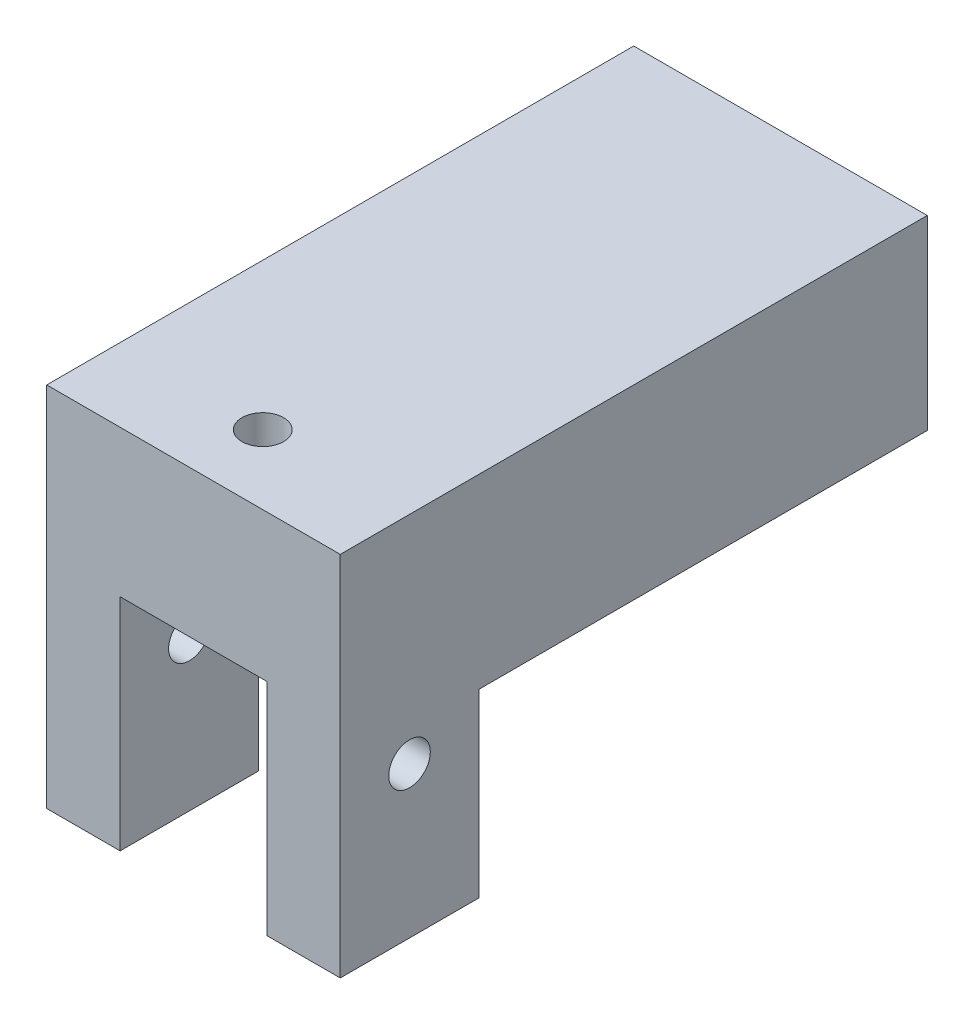
ISO-10303-21;
HEADER;
FILE_DESCRIPTION(('STEP AP214'),'2;1');
FILE_NAME('part.step','',(''),(''),'','','');
FILE_SCHEMA(('AUTOMOTIVE_DESIGN { 1 0 10303 214 1 1 1 1 }'));
ENDSEC;
DATA;
#1=APPLICATION_CONTEXT('core data for automotive mechanical design processes');
#2=APPLICATION_PROTOCOL_DEFINITION('international standard','automotive_design',2000,#1);
#3=PRODUCT_CONTEXT('',#1,'mechanical');
#4=PRODUCT('Part','Part','',(#3));
#5=PRODUCT_RELATED_PRODUCT_CATEGORY('part','',(#4));
#6=PRODUCT_DEFINITION_FORMATION('','',#4);
#7=PRODUCT_DEFINITION_CONTEXT('part definition',#1,'design');
#8=PRODUCT_DEFINITION('design','',#6,#7);
#9=PRODUCT_DEFINITION_SHAPE('','',#8);
#10=(LENGTH_UNIT() NAMED_UNIT(*) SI_UNIT(.MILLI.,.METRE.));
#11=(NAMED_UNIT(*) PLANE_ANGLE_UNIT() SI_UNIT($,.RADIAN.));
#12=(NAMED_UNIT(*) SI_UNIT($,.STERADIAN.) SOLID_ANGLE_UNIT());
#13=UNCERTAINTY_MEASURE_WITH_UNIT(LENGTH_MEASURE(1.E-05),#10,'distance_accuracy_value','');
#14=(GEOMETRIC_REPRESENTATION_CONTEXT(3) GLOBAL_UNCERTAINTY_ASSIGNED_CONTEXT((#13)) GLOBAL_UNIT_ASSIGNED_CONTEXT((#10,
#11,#12)) REPRESENTATION_CONTEXT('',''));
#15=CARTESIAN_POINT('',(0.,0.,0.));
#16=DIRECTION('',(0.,0.,1.));
#17=DIRECTION('',(1.,0.,0.));
#18=AXIS2_PLACEMENT_3D('',#15,#16,#17);
#19=CARTESIAN_POINT('',(25.4,0.,-11.9888));
#20=DIRECTION('',(0.,1.,0.));
#21=DIRECTION('',(0.,0.,1.));
#22=AXIS2_PLACEMENT_3D('',#19,#20,#21);
#23=PLANE('',#22);
#24=DIRECTION('',(-1.,0.,0.));
#25=VECTOR('',#24,1.);
#26=CARTESIAN_POINT('',(25.4,0.,0.));
#27=LINE('',#26,#25);
#28=CARTESIAN_POINT('',(25.4,0.,0.));
#29=VERTEX_POINT('',#28);
#30=CARTESIAN_POINT('',(19.05,0.,0.));
#31=VERTEX_POINT('',#30);
#32=EDGE_CURVE('E164',#29,#31,#27,.T.);
#33=ORIENTED_EDGE('',*,*,#32,.T.);
#34=DIRECTION('',(0.,0.,1.));
#35=VECTOR('',#34,1.);
#36=CARTESIAN_POINT('',(19.05,0.,-34.8840505991963));
#37=LINE('',#36,#35);
#38=CARTESIAN_POINT('',(19.05,0.,-11.9888));
#39=VERTEX_POINT('',#38);
#40=EDGE_CURVE('E225',#39,#31,#37,.T.);
#41=ORIENTED_EDGE('',*,*,#40,.F.);
#42=DIRECTION('',(-1.,0.,0.));
#43=VECTOR('',#42,1.);
#44=CARTESIAN_POINT('',(25.4,0.,-11.9888));
#45=LINE('',#44,#43);
#46=CARTESIAN_POINT('',(25.4,0.,-11.9888));
#47=VERTEX_POINT('',#46);
#48=EDGE_CURVE('E11',#47,#39,#45,.T.);
#49=ORIENTED_EDGE('',*,*,#48,.F.);
#50=DIRECTION('',(0.,0.,-1.));
#51=VECTOR('',#50,1.);
#52=CARTESIAN_POINT('',(25.4,0.,-11.9888));
#53=LINE('',#52,#51);
#54=EDGE_CURVE('E163',#29,#47,#53,.T.);
#55=ORIENTED_EDGE('',*,*,#54,.F.);
#56=EDGE_LOOP('',(#33,#41,#49,#55));
#57=FACE_BOUND('',#56,.T.);
#58=ADVANCED_FACE('F41',(#57),#23,.F.);
#59=CARTESIAN_POINT('',(25.4,15.6337,-11.9888));
#60=DIRECTION('',(0.,0.,1.));
#61=DIRECTION('',(0.,-1.,0.));
#62=AXIS2_PLACEMENT_3D('',#59,#60,#61);
#63=PLANE('',#62);
#64=ORIENTED_EDGE('',*,*,#48,.T.);
#65=DIRECTION('',(0.,-1.,0.));
#66=VECTOR('',#65,1.);
#67=CARTESIAN_POINT('',(19.05,19.05,-11.9888));
#68=LINE('',#67,#66);
#69=CARTESIAN_POINT('',(19.05,15.6337,-11.9888));
#70=VERTEX_POINT('',#69);
#71=EDGE_CURVE('E242',#70,#39,#68,.T.);
#72=ORIENTED_EDGE('',*,*,#71,.F.);
#73=DIRECTION('',(-1.,0.,0.));
#74=VECTOR('',#73,1.);
#75=CARTESIAN_POINT('',(25.4,15.6337,-11.9888));
#76=LINE('',#75,#74);
#77=CARTESIAN_POINT('',(25.4,15.6337,-11.9888));
#78=VERTEX_POINT('',#77);
#79=EDGE_CURVE('E173',#78,#70,#76,.T.);
#80=ORIENTED_EDGE('',*,*,#79,.F.);
#81=DIRECTION('',(0.,1.,0.));
#82=VECTOR('',#81,1.);
#83=CARTESIAN_POINT('',(25.4,15.6337,-11.9888));
#84=LINE('',#83,#82);
#85=EDGE_CURVE('E103',#47,#78,#84,.T.);
#86=ORIENTED_EDGE('',*,*,#85,.F.);
#87=EDGE_LOOP('',(#64,#72,#80,#86));
#88=FACE_BOUND('',#87,.T.);
#89=ADVANCED_FACE('F285',(#88),#63,.F.);
#90=CARTESIAN_POINT('',(6.35,0.,-11.9888));
#91=VERTEX_POINT('',#90);
#92=CARTESIAN_POINT('',(0.,0.,-11.9888));
#93=VERTEX_POINT('',#92);
#94=EDGE_CURVE('E51',#91,#93,#45,.T.);
#95=ORIENTED_EDGE('',*,*,#94,.F.);
#96=DIRECTION('',(0.,0.,1.));
#97=VECTOR('',#96,1.);
#98=CARTESIAN_POINT('',(6.35,0.,-34.8840505991963));
#99=LINE('',#98,#97);
#100=CARTESIAN_POINT('',(6.35,0.,0.));
#101=VERTEX_POINT('',#100);
#102=EDGE_CURVE('E222',#91,#101,#99,.T.);
#103=ORIENTED_EDGE('',*,*,#102,.T.);
#104=CARTESIAN_POINT('',(0.,0.,0.));
#105=VERTEX_POINT('',#104);
#106=EDGE_CURVE('E95',#101,#105,#27,.T.);
#107=ORIENTED_EDGE('',*,*,#106,.T.);
#108=DIRECTION('',(0.,0.,-1.));
#109=VECTOR('',#108,1.);
#110=CARTESIAN_POINT('',(0.,0.,-11.9888));
#111=LINE('',#110,#109);
#112=EDGE_CURVE('E144',#105,#93,#111,.T.);
#113=ORIENTED_EDGE('',*,*,#112,.T.);
#114=EDGE_LOOP('',(#95,#103,#107,#113));
#115=FACE_BOUND('',#114,.T.);
#116=ADVANCED_FACE('F43',(#115),#23,.F.);
#117=CARTESIAN_POINT('',(6.35,15.6337,-11.9888));
#118=VERTEX_POINT('',#117);
#119=CARTESIAN_POINT('',(0.,15.6337,-11.9888));
#120=VERTEX_POINT('',#119);
#121=EDGE_CURVE('E172',#118,#120,#76,.T.);
#122=ORIENTED_EDGE('',*,*,#121,.F.);
#123=DIRECTION('',(0.,1.,0.));
#124=VECTOR('',#123,1.);
#125=CARTESIAN_POINT('',(6.35,19.05,-11.9888));
#126=LINE('',#125,#124);
#127=EDGE_CURVE('E243',#91,#118,#126,.T.);
#128=ORIENTED_EDGE('',*,*,#127,.F.);
#129=ORIENTED_EDGE('',*,*,#94,.T.);
#130=DIRECTION('',(0.,1.,0.));
#131=VECTOR('',#130,1.);
#132=CARTESIAN_POINT('',(0.,15.6337,-11.9888));
#133=LINE('',#132,#131);
#134=EDGE_CURVE('E147',#93,#120,#133,.T.);
#135=ORIENTED_EDGE('',*,*,#134,.T.);
#136=EDGE_LOOP('',(#122,#128,#129,#135));
#137=FACE_BOUND('',#136,.T.);
#138=ADVANCED_FACE('F190',(#137),#63,.F.);
#139=CARTESIAN_POINT('',(25.4,15.6337,-11.9888));
#140=DIRECTION('',(0.,1.,0.));
#141=DIRECTION('',(0.,0.,1.));
#142=AXIS2_PLACEMENT_3D('',#139,#140,#141);
#143=PLANE('',#142);
#144=DIRECTION('',(0.,0.,-1.));
#145=VECTOR('',#144,1.);
#146=CARTESIAN_POINT('',(0.,15.6337,-11.9888));
#147=LINE('',#146,#145);
#148=CARTESIAN_POINT('',(0.,15.6337,-50.8));
#149=VERTEX_POINT('',#148);
#150=EDGE_CURVE('E152',#120,#149,#147,.T.);
#151=ORIENTED_EDGE('',*,*,#150,.T.);
#152=DIRECTION('',(-1.,0.,0.));
#153=VECTOR('',#152,1.);
#154=CARTESIAN_POINT('',(25.4,15.6337,-50.8));
#155=LINE('',#154,#153);
#156=CARTESIAN_POINT('',(25.4,15.6337,-50.8));
#157=VERTEX_POINT('',#156);
#158=EDGE_CURVE('E133',#157,#149,#155,.T.);
#159=ORIENTED_EDGE('',*,*,#158,.F.);
#160=DIRECTION('',(0.,0.,-1.));
#161=VECTOR('',#160,1.);
#162=CARTESIAN_POINT('',(25.4,15.6337,-11.9888));
#163=LINE('',#162,#161);
#164=EDGE_CURVE('E119',#78,#157,#163,.T.);
#165=ORIENTED_EDGE('',*,*,#164,.F.);
#166=ORIENTED_EDGE('',*,*,#79,.T.);
#167=EDGE_CURVE('E176',#70,#118,#76,.T.);
#168=ORIENTED_EDGE('',*,*,#167,.T.);
#169=ORIENTED_EDGE('',*,*,#121,.T.);
#170=EDGE_LOOP('',(#151,#159,#165,#166,#168,#169));
#171=FACE_BOUND('',#170,.T.);
#172=ADVANCED_FACE('F183',(#171),#143,.F.);
#173=CARTESIAN_POINT('',(25.4,31.75,-50.8));
#174=DIRECTION('',(0.,0.,1.));
#175=DIRECTION('',(1.,0.,0.));
#176=AXIS2_PLACEMENT_3D('',#173,#174,#175);
#177=PLANE('',#176);
#178=DIRECTION('',(0.,1.,0.));
#179=VECTOR('',#178,1.);
#180=CARTESIAN_POINT('',(0.,31.75,-50.8));
#181=LINE('',#180,#179);
#182=CARTESIAN_POINT('',(0.,31.75,-50.8));
#183=VERTEX_POINT('',#182);
#184=EDGE_CURVE('E129',#149,#183,#181,.T.);
#185=ORIENTED_EDGE('',*,*,#184,.T.);
#186=DIRECTION('',(-1.,0.,0.));
#187=VECTOR('',#186,1.);
#188=CARTESIAN_POINT('',(25.4,31.75,-50.8));
#189=LINE('',#188,#187);
#190=CARTESIAN_POINT('',(25.4,31.75,-50.8));
#191=VERTEX_POINT('',#190);
#192=EDGE_CURVE('E126',#191,#183,#189,.T.);
#193=ORIENTED_EDGE('',*,*,#192,.F.);
#194=DIRECTION('',(0.,1.,0.));
#195=VECTOR('',#194,1.);
#196=CARTESIAN_POINT('',(25.4,31.75,-50.8));
#197=LINE('',#196,#195);
#198=EDGE_CURVE('E112',#157,#191,#197,.T.);
#199=ORIENTED_EDGE('',*,*,#198,.F.);
#200=ORIENTED_EDGE('',*,*,#158,.T.);
#201=EDGE_LOOP('',(#185,#193,#199,#200));
#202=FACE_BOUND('',#201,.T.);
#203=ADVANCED_FACE('F127',(#202),#177,.F.);
#204=CARTESIAN_POINT('',(25.4,31.75,0.));
#205=DIRECTION('',(0.,-1.,0.));
#206=DIRECTION('',(0.,0.,-1.));
#207=AXIS2_PLACEMENT_3D('',#204,#205,#206);
#208=PLANE('',#207);
#209=CARTESIAN_POINT('',(12.7,31.75,-5.9944));
#210=DIRECTION('',(0.,1.,0.));
#211=DIRECTION('',(0.,0.,1.));
#212=AXIS2_PLACEMENT_3D('',#209,#210,#211);
#213=CIRCLE('',#212,1.79999999999999);
#214=CARTESIAN_POINT('',(12.7,31.75,-4.19440000000001));
#215=VERTEX_POINT('',#214);
#216=EDGE_CURVE('E262',#215,#215,#213,.T.);
#217=ORIENTED_EDGE('',*,*,#216,.F.);
#218=EDGE_LOOP('',(#217));
#219=FACE_BOUND('',#218,.T.);
#220=DIRECTION('',(0.,0.,1.));
#221=VECTOR('',#220,1.);
#222=CARTESIAN_POINT('',(0.,31.75,0.));
#223=LINE('',#222,#221);
#224=CARTESIAN_POINT('',(0.,31.75,0.));
#225=VERTEX_POINT('',#224);
#226=EDGE_CURVE('E157',#183,#225,#223,.T.);
#227=ORIENTED_EDGE('',*,*,#226,.T.);
#228=DIRECTION('',(-1.,0.,0.));
#229=VECTOR('',#228,1.);
#230=CARTESIAN_POINT('',(25.4,31.75,0.));
#231=LINE('',#230,#229);
#232=CARTESIAN_POINT('',(25.4,31.75,0.));
#233=VERTEX_POINT('',#232);
#234=EDGE_CURVE('E134',#233,#225,#231,.T.);
#235=ORIENTED_EDGE('',*,*,#234,.F.);
#236=DIRECTION('',(0.,0.,1.));
#237=VECTOR('',#236,1.);
#238=CARTESIAN_POINT('',(25.4,31.75,0.));
#239=LINE('',#238,#237);
#240=EDGE_CURVE('E116',#191,#233,#239,.T.);
#241=ORIENTED_EDGE('',*,*,#240,.F.);
#242=ORIENTED_EDGE('',*,*,#192,.T.);
#243=EDGE_LOOP('',(#227,#235,#241,#242));
#244=FACE_BOUND('',#243,.T.);
#245=ADVANCED_FACE('F136',(#219,#244),#208,.F.);
#246=CARTESIAN_POINT('',(25.4,0.,0.));
#247=DIRECTION('',(0.,0.,-1.));
#248=DIRECTION('',(-1.,0.,0.));
#249=AXIS2_PLACEMENT_3D('',#246,#247,#248);
#250=PLANE('',#249);
#251=DIRECTION('',(-1.,0.,0.));
#252=VECTOR('',#251,1.);
#253=CARTESIAN_POINT('',(6.35,19.05,0.));
#254=LINE('',#253,#252);
#255=CARTESIAN_POINT('',(19.05,19.05,0.));
#256=VERTEX_POINT('',#255);
#257=CARTESIAN_POINT('',(6.35,19.05,0.));
#258=VERTEX_POINT('',#257);
#259=EDGE_CURVE('E232',#256,#258,#254,.T.);
#260=ORIENTED_EDGE('',*,*,#259,.F.);
#261=DIRECTION('',(0.,1.,0.));
#262=VECTOR('',#261,1.);
#263=CARTESIAN_POINT('',(19.05,19.05,0.));
#264=LINE('',#263,#262);
#265=EDGE_CURVE('E58',#31,#256,#264,.T.);
#266=ORIENTED_EDGE('',*,*,#265,.F.);
#267=ORIENTED_EDGE('',*,*,#32,.F.);
#268=DIRECTION('',(0.,-1.,0.));
#269=VECTOR('',#268,1.);
#270=CARTESIAN_POINT('',(25.4,0.,0.));
#271=LINE('',#270,#269);
#272=EDGE_CURVE('E67',#233,#29,#271,.T.);
#273=ORIENTED_EDGE('',*,*,#272,.F.);
#274=ORIENTED_EDGE('',*,*,#234,.T.);
#275=DIRECTION('',(0.,-1.,0.));
#276=VECTOR('',#275,1.);
#277=CARTESIAN_POINT('',(0.,0.,0.));
#278=LINE('',#277,#276);
#279=EDGE_CURVE('E160',#225,#105,#278,.T.);
#280=ORIENTED_EDGE('',*,*,#279,.T.);
#281=ORIENTED_EDGE('',*,*,#106,.F.);
#282=DIRECTION('',(0.,-1.,0.));
#283=VECTOR('',#282,1.);
#284=CARTESIAN_POINT('',(6.35,19.05,0.));
#285=LINE('',#284,#283);
#286=EDGE_CURVE('E218',#258,#101,#285,.T.);
#287=ORIENTED_EDGE('',*,*,#286,.F.);
#288=EDGE_LOOP('',(#260,#266,#267,#273,#274,#280,#281,#287));
#289=FACE_BOUND('',#288,.T.);
#290=ADVANCED_FACE('F198',(#289),#250,.F.);
#291=CARTESIAN_POINT('',(25.4,0.,0.));
#292=DIRECTION('',(-1.,0.,0.));
#293=DIRECTION('',(0.,0.,1.));
#294=AXIS2_PLACEMENT_3D('',#291,#292,#293);
#295=PLANE('',#294);
#296=CARTESIAN_POINT('',(25.4,13.0556,-5.9944));
#297=DIRECTION('',(1.,0.,0.));
#298=DIRECTION('',(0.,0.,-1.));
#299=AXIS2_PLACEMENT_3D('',#296,#297,#298);
#300=CIRCLE('',#299,1.79999999999999);
#301=CARTESIAN_POINT('',(25.4,13.0556,-7.79439999999999));
#302=VERTEX_POINT('',#301);
#303=EDGE_CURVE('E258',#302,#302,#300,.T.);
#304=ORIENTED_EDGE('',*,*,#303,.F.);
#305=EDGE_LOOP('',(#304));
#306=FACE_BOUND('',#305,.T.);
#307=ORIENTED_EDGE('',*,*,#54,.T.);
#308=ORIENTED_EDGE('',*,*,#85,.T.);
#309=ORIENTED_EDGE('',*,*,#164,.T.);
#310=ORIENTED_EDGE('',*,*,#198,.T.);
#311=ORIENTED_EDGE('',*,*,#240,.T.);
#312=ORIENTED_EDGE('',*,*,#272,.T.);
#313=EDGE_LOOP('',(#307,#308,#309,#310,#311,#312));
#314=FACE_BOUND('',#313,.T.);
#315=ADVANCED_FACE('F114',(#306,#314),#295,.F.);
#316=CARTESIAN_POINT('',(0.,0.,0.));
#317=DIRECTION('',(-1.,0.,0.));
#318=DIRECTION('',(0.,0.,1.));
#319=AXIS2_PLACEMENT_3D('',#316,#317,#318);
#320=PLANE('',#319);
#321=CARTESIAN_POINT('',(0.,13.0556,-5.9944));
#322=DIRECTION('',(1.,0.,0.));
#323=DIRECTION('',(0.,0.,-1.));
#324=AXIS2_PLACEMENT_3D('',#321,#322,#323);
#325=CIRCLE('',#324,1.8);
#326=CARTESIAN_POINT('',(0.,13.0556,-7.7944));
#327=VERTEX_POINT('',#326);
#328=EDGE_CURVE('E254',#327,#327,#325,.T.);
#329=ORIENTED_EDGE('',*,*,#328,.T.);
#330=EDGE_LOOP('',(#329));
#331=FACE_BOUND('',#330,.T.);
#332=ORIENTED_EDGE('',*,*,#112,.F.);
#333=ORIENTED_EDGE('',*,*,#279,.F.);
#334=ORIENTED_EDGE('',*,*,#226,.F.);
#335=ORIENTED_EDGE('',*,*,#184,.F.);
#336=ORIENTED_EDGE('',*,*,#150,.F.);
#337=ORIENTED_EDGE('',*,*,#134,.F.);
#338=EDGE_LOOP('',(#332,#333,#334,#335,#336,#337));
#339=FACE_BOUND('',#338,.T.);
#340=ADVANCED_FACE('F194',(#331,#339),#320,.T.);
#341=CARTESIAN_POINT('',(25.4,15.6337,-11.9888));
#342=DIRECTION('',(0.,0.,1.));
#343=DIRECTION('',(0.,-1.,0.));
#344=AXIS2_PLACEMENT_3D('',#341,#342,#343);
#345=PLANE('',#344);
#346=ORIENTED_EDGE('',*,*,#167,.F.);
#347=CARTESIAN_POINT('',(19.05,19.05,-11.9888));
#348=VERTEX_POINT('',#347);
#349=EDGE_CURVE('E213',#348,#70,#68,.T.);
#350=ORIENTED_EDGE('',*,*,#349,.F.);
#351=DIRECTION('',(1.,0.,0.));
#352=VECTOR('',#351,1.);
#353=CARTESIAN_POINT('',(6.35,19.05,-11.9888));
#354=LINE('',#353,#352);
#355=CARTESIAN_POINT('',(6.35,19.05,-11.9888));
#356=VERTEX_POINT('',#355);
#357=EDGE_CURVE('E148',#356,#348,#354,.T.);
#358=ORIENTED_EDGE('',*,*,#357,.F.);
#359=EDGE_CURVE('E228',#118,#356,#126,.T.);
#360=ORIENTED_EDGE('',*,*,#359,.F.);
#361=EDGE_LOOP('',(#346,#350,#358,#360));
#362=FACE_BOUND('',#361,.T.);
#363=ADVANCED_FACE('F322',(#362),#345,.T.);
#364=CARTESIAN_POINT('',(19.05,19.05,-34.8840505991963));
#365=DIRECTION('',(1.,0.,0.));
#366=DIRECTION('',(0.,0.,-1.));
#367=AXIS2_PLACEMENT_3D('',#364,#365,#366);
#368=PLANE('',#367);
#369=CARTESIAN_POINT('',(19.05,13.0556,-5.9944));
#370=DIRECTION('',(1.,0.,0.));
#371=DIRECTION('',(0.,0.,-1.));
#372=AXIS2_PLACEMENT_3D('',#369,#370,#371);
#373=CIRCLE('',#372,1.79999999999999);
#374=CARTESIAN_POINT('',(19.05,13.0556,-7.79439999999999));
#375=VERTEX_POINT('',#374);
#376=EDGE_CURVE('E250',#375,#375,#373,.T.);
#377=ORIENTED_EDGE('',*,*,#376,.T.);
#378=EDGE_LOOP('',(#377));
#379=FACE_BOUND('',#378,.T.);
#380=ORIENTED_EDGE('',*,*,#349,.T.);
#381=ORIENTED_EDGE('',*,*,#71,.T.);
#382=ORIENTED_EDGE('',*,*,#40,.T.);
#383=ORIENTED_EDGE('',*,*,#265,.T.);
#384=DIRECTION('',(0.,0.,1.));
#385=VECTOR('',#384,1.);
#386=CARTESIAN_POINT('',(19.05,19.05,-34.8840505991963));
#387=LINE('',#386,#385);
#388=EDGE_CURVE('E214',#348,#256,#387,.T.);
#389=ORIENTED_EDGE('',*,*,#388,.F.);
#390=EDGE_LOOP('',(#380,#381,#382,#383,#389));
#391=FACE_BOUND('',#390,.T.);
#392=ADVANCED_FACE('F317',(#379,#391),#368,.F.);
#393=CARTESIAN_POINT('',(6.35,19.05,-34.8840505991963));
#394=DIRECTION('',(-1.,0.,0.));
#395=DIRECTION('',(0.,-1.,0.));
#396=AXIS2_PLACEMENT_3D('',#393,#394,#395);
#397=PLANE('',#396);
#398=CARTESIAN_POINT('',(6.35,13.0556,-5.9944));
#399=DIRECTION('',(-1.,0.,0.));
#400=DIRECTION('',(0.,-1.,0.));
#401=AXIS2_PLACEMENT_3D('',#398,#399,#400);
#402=CIRCLE('',#401,1.79999999999999);
#403=CARTESIAN_POINT('',(6.35,11.2556,-5.9944));
#404=VERTEX_POINT('',#403);
#405=EDGE_CURVE('E238',#404,#404,#402,.T.);
#406=ORIENTED_EDGE('',*,*,#405,.T.);
#407=EDGE_LOOP('',(#406));
#408=FACE_BOUND('',#407,.T.);
#409=ORIENTED_EDGE('',*,*,#127,.T.);
#410=ORIENTED_EDGE('',*,*,#359,.T.);
#411=DIRECTION('',(0.,0.,1.));
#412=VECTOR('',#411,1.);
#413=CARTESIAN_POINT('',(6.35,19.05,-34.8840505991963));
#414=LINE('',#413,#412);
#415=EDGE_CURVE('E217',#356,#258,#414,.T.);
#416=ORIENTED_EDGE('',*,*,#415,.T.);
#417=ORIENTED_EDGE('',*,*,#286,.T.);
#418=ORIENTED_EDGE('',*,*,#102,.F.);
#419=EDGE_LOOP('',(#409,#410,#416,#417,#418));
#420=FACE_BOUND('',#419,.T.);
#421=ADVANCED_FACE('F312',(#408,#420),#397,.F.);
#422=CARTESIAN_POINT('',(6.35,19.05,-34.8840505991963));
#423=DIRECTION('',(0.,1.,0.));
#424=DIRECTION('',(-1.,0.,0.));
#425=AXIS2_PLACEMENT_3D('',#422,#423,#424);
#426=PLANE('',#425);
#427=CARTESIAN_POINT('',(12.7,19.05,-5.9944));
#428=DIRECTION('',(0.,1.,0.));
#429=DIRECTION('',(-1.,0.,0.));
#430=AXIS2_PLACEMENT_3D('',#427,#428,#429);
#431=CIRCLE('',#430,1.79999999999999);
#432=CARTESIAN_POINT('',(10.9,19.05,-5.9944));
#433=VERTEX_POINT('',#432);
#434=EDGE_CURVE('E45',#433,#433,#431,.T.);
#435=ORIENTED_EDGE('',*,*,#434,.T.);
#436=EDGE_LOOP('',(#435));
#437=FACE_BOUND('',#436,.T.);
#438=ORIENTED_EDGE('',*,*,#357,.T.);
#439=ORIENTED_EDGE('',*,*,#388,.T.);
#440=ORIENTED_EDGE('',*,*,#259,.T.);
#441=ORIENTED_EDGE('',*,*,#415,.F.);
#442=EDGE_LOOP('',(#438,#439,#440,#441));
#443=FACE_BOUND('',#442,.T.);
#444=ADVANCED_FACE('F271',(#437,#443),#426,.F.);
#445=CARTESIAN_POINT('',(25.4,13.0556,-5.9944));
#446=DIRECTION('',(1.,0.,0.));
#447=DIRECTION('',(0.,0.,-1.));
#448=AXIS2_PLACEMENT_3D('',#445,#446,#447);
#449=CYLINDRICAL_SURFACE('',#448,1.79999999999999);
#450=ORIENTED_EDGE('',*,*,#328,.F.);
#451=EDGE_LOOP('',(#450));
#452=FACE_BOUND('',#451,.T.);
#453=ORIENTED_EDGE('',*,*,#405,.F.);
#454=EDGE_LOOP('',(#453));
#455=FACE_BOUND('',#454,.T.);
#456=ADVANCED_FACE('F281',(#452,#455),#449,.F.);
#457=ORIENTED_EDGE('',*,*,#303,.T.);
#458=EDGE_LOOP('',(#457));
#459=FACE_BOUND('',#458,.T.);
#460=ORIENTED_EDGE('',*,*,#376,.F.);
#461=EDGE_LOOP('',(#460));
#462=FACE_BOUND('',#461,.T.);
#463=ADVANCED_FACE('F276',(#459,#462),#449,.F.);
#464=CARTESIAN_POINT('',(12.7,31.75,-5.9944));
#465=DIRECTION('',(0.,1.,0.));
#466=DIRECTION('',(0.,0.,1.));
#467=AXIS2_PLACEMENT_3D('',#464,#465,#466);
#468=CYLINDRICAL_SURFACE('',#467,1.79999999999999);
#469=ORIENTED_EDGE('',*,*,#216,.T.);
#470=EDGE_LOOP('',(#469));
#471=FACE_BOUND('',#470,.T.);
#472=ORIENTED_EDGE('',*,*,#434,.F.);
#473=EDGE_LOOP('',(#472));
#474=FACE_BOUND('',#473,.T.);
#475=ADVANCED_FACE('F274',(#471,#474),#468,.F.);
#476=CLOSED_SHELL('',(#58,#89,#116,#138,#172,#203,#245,#290,#315,#340,#363,#392,#421,#444,#456,
#463,#475));
#477=MANIFOLD_SOLID_BREP('B2',#476);
#478=ADVANCED_BREP_SHAPE_REPRESENTATION('',(#18,#477),#14);
#479=SHAPE_DEFINITION_REPRESENTATION(#9,#478);
ENDSEC;
END-ISO-10303-21;
